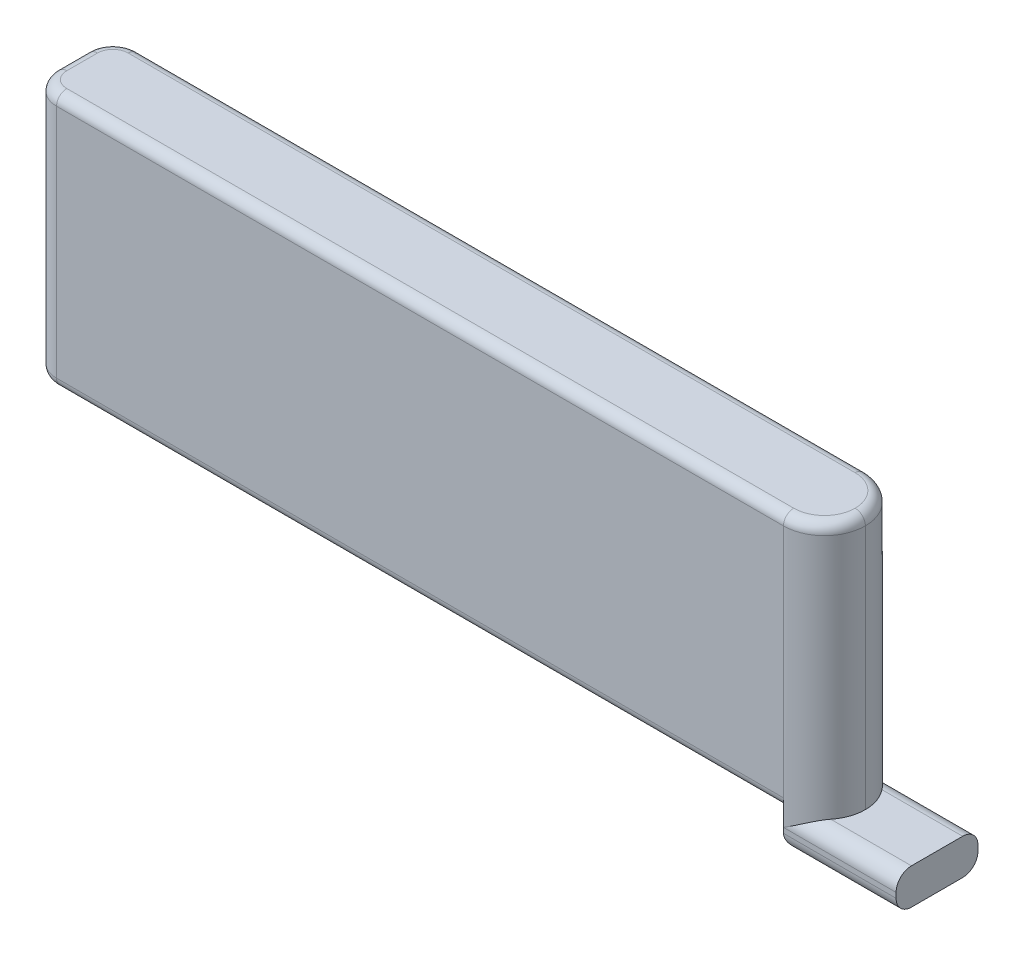
ISO-10303-21;
HEADER;
FILE_DESCRIPTION(('STEP AP214'),'2;1');
FILE_NAME('part.step','',(''),(''),'','','');
FILE_SCHEMA(('AUTOMOTIVE_DESIGN { 1 0 10303 214 1 1 1 1 }'));
ENDSEC;
DATA;
#1=APPLICATION_CONTEXT('core data for automotive mechanical design processes');
#2=APPLICATION_PROTOCOL_DEFINITION('international standard','automotive_design',2000,#1);
#3=PRODUCT_CONTEXT('',#1,'mechanical');
#4=PRODUCT('Part','Part','',(#3));
#5=PRODUCT_RELATED_PRODUCT_CATEGORY('part','',(#4));
#6=PRODUCT_DEFINITION_FORMATION('','',#4);
#7=PRODUCT_DEFINITION_CONTEXT('part definition',#1,'design');
#8=PRODUCT_DEFINITION('design','',#6,#7);
#9=PRODUCT_DEFINITION_SHAPE('','',#8);
#10=(LENGTH_UNIT() NAMED_UNIT(*) SI_UNIT(.MILLI.,.METRE.));
#11=(NAMED_UNIT(*) PLANE_ANGLE_UNIT() SI_UNIT($,.RADIAN.));
#12=(NAMED_UNIT(*) SI_UNIT($,.STERADIAN.) SOLID_ANGLE_UNIT());
#13=UNCERTAINTY_MEASURE_WITH_UNIT(LENGTH_MEASURE(1.E-05),#10,'distance_accuracy_value','');
#14=(GEOMETRIC_REPRESENTATION_CONTEXT(3) GLOBAL_UNCERTAINTY_ASSIGNED_CONTEXT((#13)) GLOBAL_UNIT_ASSIGNED_CONTEXT((#10,
#11,#12)) REPRESENTATION_CONTEXT('',''));
#15=CARTESIAN_POINT('',(0.,0.,0.));
#16=DIRECTION('',(0.,0.,1.));
#17=DIRECTION('',(1.,0.,0.));
#18=AXIS2_PLACEMENT_3D('',#15,#16,#17);
#19=CARTESIAN_POINT('',(0.,0.,16.));
#20=DIRECTION('',(0.,0.,1.));
#21=DIRECTION('',(1.,0.,0.));
#22=AXIS2_PLACEMENT_3D('',#19,#20,#21);
#23=PLANE('',#22);
#24=DIRECTION('',(0.,1.,0.));
#25=VECTOR('',#24,1.);
#26=CARTESIAN_POINT('',(92.1561214272367,21.854032832294,16.));
#27=LINE('',#26,#25);
#28=CARTESIAN_POINT('',(92.1561214272366,-26.145967167706,16.));
#29=VERTEX_POINT('',#28);
#30=CARTESIAN_POINT('',(92.1561214272367,19.854032832294,16.));
#31=VERTEX_POINT('',#30);
#32=EDGE_CURVE('E277',#29,#31,#27,.T.);
#33=ORIENTED_EDGE('',*,*,#32,.T.);
#34=DIRECTION('',(-1.,0.,0.));
#35=VECTOR('',#34,1.);
#36=CARTESIAN_POINT('',(-49.8438785727633,19.854032832294,16.));
#37=LINE('',#36,#35);
#38=CARTESIAN_POINT('',(-49.8438785727633,19.854032832294,16.));
#39=VERTEX_POINT('',#38);
#40=EDGE_CURVE('E445',#31,#39,#37,.T.);
#41=ORIENTED_EDGE('',*,*,#40,.T.);
#42=DIRECTION('',(0.,-1.,0.));
#43=VECTOR('',#42,1.);
#44=CARTESIAN_POINT('',(-49.8438785727633,-28.145967167706,16.));
#45=LINE('',#44,#43);
#46=CARTESIAN_POINT('',(-49.8438785727633,-26.145967167706,16.));
#47=VERTEX_POINT('',#46);
#48=EDGE_CURVE('E249',#39,#47,#45,.T.);
#49=ORIENTED_EDGE('',*,*,#48,.T.);
#50=DIRECTION('',(1.,0.,0.));
#51=VECTOR('',#50,1.);
#52=CARTESIAN_POINT('',(92.1561214272367,-26.145967167706,16.));
#53=LINE('',#52,#51);
#54=EDGE_CURVE('E425',#47,#29,#53,.T.);
#55=ORIENTED_EDGE('',*,*,#54,.T.);
#56=EDGE_LOOP('',(#33,#41,#49,#55));
#57=FACE_BOUND('',#56,.T.);
#58=ADVANCED_FACE('F35',(#57),#23,.T.);
#59=CARTESIAN_POINT('',(0.,0.,0.));
#60=DIRECTION('',(0.,0.,1.));
#61=DIRECTION('',(1.,0.,0.));
#62=AXIS2_PLACEMENT_3D('',#59,#60,#61);
#63=PLANE('',#62);
#64=DIRECTION('',(0.,-1.,0.));
#65=VECTOR('',#64,1.);
#66=CARTESIAN_POINT('',(-49.8438785727633,0.,0.));
#67=LINE('',#66,#65);
#68=CARTESIAN_POINT('',(-49.8438785727633,-26.145967167706,0.));
#69=VERTEX_POINT('',#68);
#70=CARTESIAN_POINT('',(-49.8438785727633,19.854032832294,0.));
#71=VERTEX_POINT('',#70);
#72=EDGE_CURVE('E246',#69,#71,#67,.F.);
#73=ORIENTED_EDGE('',*,*,#72,.T.);
#74=DIRECTION('',(-1.,0.,0.));
#75=VECTOR('',#74,1.);
#76=CARTESIAN_POINT('',(0.,19.854032832294,0.));
#77=LINE('',#76,#75);
#78=CARTESIAN_POINT('',(92.1561214272367,19.854032832294,0.));
#79=VERTEX_POINT('',#78);
#80=EDGE_CURVE('E437',#71,#79,#77,.F.);
#81=ORIENTED_EDGE('',*,*,#80,.T.);
#82=DIRECTION('',(0.,1.,0.));
#83=VECTOR('',#82,1.);
#84=CARTESIAN_POINT('',(92.1561214272367,0.,0.));
#85=LINE('',#84,#83);
#86=CARTESIAN_POINT('',(92.1561214272366,-26.145967167706,0.));
#87=VERTEX_POINT('',#86);
#88=EDGE_CURVE('E252',#79,#87,#85,.F.);
#89=ORIENTED_EDGE('',*,*,#88,.T.);
#90=DIRECTION('',(1.,0.,0.));
#91=VECTOR('',#90,1.);
#92=CARTESIAN_POINT('',(0.,-26.145967167706,0.));
#93=LINE('',#92,#91);
#94=EDGE_CURVE('E435',#87,#69,#93,.F.);
#95=ORIENTED_EDGE('',*,*,#94,.T.);
#96=EDGE_LOOP('',(#73,#81,#89,#95));
#97=FACE_BOUND('',#96,.T.);
#98=ADVANCED_FACE('F388',(#97),#63,.F.);
#99=CARTESIAN_POINT('',(-54.8438785727633,21.854032832294,16.));
#100=DIRECTION('',(1.,0.,0.));
#101=DIRECTION('',(0.,1.,0.));
#102=AXIS2_PLACEMENT_3D('',#99,#100,#101);
#103=PLANE('',#102);
#104=DIRECTION('',(0.,-1.,0.));
#105=VECTOR('',#104,1.);
#106=CARTESIAN_POINT('',(-54.8438785727633,21.854032832294,11.));
#107=LINE('',#106,#105);
#108=CARTESIAN_POINT('',(-54.8438785727633,-26.145967167706,11.));
#109=VERTEX_POINT('',#108);
#110=CARTESIAN_POINT('',(-54.8438785727633,19.854032832294,11.));
#111=VERTEX_POINT('',#110);
#112=EDGE_CURVE('E232',#109,#111,#107,.F.);
#113=ORIENTED_EDGE('',*,*,#112,.T.);
#114=DIRECTION('',(0.,0.,-1.));
#115=VECTOR('',#114,1.);
#116=CARTESIAN_POINT('',(-54.8438785727633,19.854032832294,16.));
#117=LINE('',#116,#115);
#118=CARTESIAN_POINT('',(-54.8438785727633,19.854032832294,5.));
#119=VERTEX_POINT('',#118);
#120=EDGE_CURVE('E295',#111,#119,#117,.T.);
#121=ORIENTED_EDGE('',*,*,#120,.T.);
#122=DIRECTION('',(0.,-1.,0.));
#123=VECTOR('',#122,1.);
#124=CARTESIAN_POINT('',(-54.8438785727633,21.854032832294,5.));
#125=LINE('',#124,#123);
#126=CARTESIAN_POINT('',(-54.8438785727633,-26.145967167706,5.));
#127=VERTEX_POINT('',#126);
#128=EDGE_CURVE('E243',#119,#127,#125,.T.);
#129=ORIENTED_EDGE('',*,*,#128,.T.);
#130=DIRECTION('',(0.,0.,-1.));
#131=VECTOR('',#130,1.);
#132=CARTESIAN_POINT('',(-54.8438785727633,-26.145967167706,16.));
#133=LINE('',#132,#131);
#134=EDGE_CURVE('E293',#127,#109,#133,.F.);
#135=ORIENTED_EDGE('',*,*,#134,.T.);
#136=EDGE_LOOP('',(#113,#121,#129,#135));
#137=FACE_BOUND('',#136,.T.);
#138=ADVANCED_FACE('F395',(#137),#103,.F.);
#139=CARTESIAN_POINT('',(-54.8438785727633,-28.145967167706,16.));
#140=DIRECTION('',(0.,1.,0.));
#141=DIRECTION('',(0.,0.,1.));
#142=AXIS2_PLACEMENT_3D('',#139,#140,#141);
#143=PLANE('',#142);
#144=CARTESIAN_POINT('',(-49.8438785727633,-28.145967167706,5.));
#145=DIRECTION('',(0.,1.,0.));
#146=DIRECTION('',(0.,0.,1.));
#147=AXIS2_PLACEMENT_3D('',#144,#145,#146);
#148=CIRCLE('',#147,3.);
#149=CARTESIAN_POINT('',(-52.8438785727633,-28.145967167706,5.));
#150=VERTEX_POINT('',#149);
#151=CARTESIAN_POINT('',(-49.8438785727633,-28.145967167706,2.));
#152=VERTEX_POINT('',#151);
#153=EDGE_CURVE('E432',#150,#152,#148,.F.);
#154=ORIENTED_EDGE('',*,*,#153,.T.);
#155=DIRECTION('',(1.,0.,0.));
#156=VECTOR('',#155,1.);
#157=CARTESIAN_POINT('',(-54.8438785727633,-28.145967167706,2.));
#158=LINE('',#157,#156);
#159=CARTESIAN_POINT('',(92.1561214272366,-28.145967167706,2.));
#160=VERTEX_POINT('',#159);
#161=EDGE_CURVE('E430',#152,#160,#158,.T.);
#162=ORIENTED_EDGE('',*,*,#161,.T.);
#163=DIRECTION('',(0.,0.,1.));
#164=VECTOR('',#163,1.);
#165=CARTESIAN_POINT('',(92.1561214272366,-28.145967167706,0.));
#166=LINE('',#165,#164);
#167=CARTESIAN_POINT('',(92.1561214272366,-28.145967167706,14.));
#168=VERTEX_POINT('',#167);
#169=EDGE_CURVE('E199',#160,#168,#166,.T.);
#170=ORIENTED_EDGE('',*,*,#169,.T.);
#171=DIRECTION('',(1.,0.,0.));
#172=VECTOR('',#171,1.);
#173=CARTESIAN_POINT('',(-49.8438785727633,-28.145967167706,14.));
#174=LINE('',#173,#172);
#175=CARTESIAN_POINT('',(-49.8438785727633,-28.145967167706,14.));
#176=VERTEX_POINT('',#175);
#177=EDGE_CURVE('E301',#168,#176,#174,.F.);
#178=ORIENTED_EDGE('',*,*,#177,.T.);
#179=CARTESIAN_POINT('',(-49.8438785727633,-28.145967167706,11.));
#180=DIRECTION('',(0.,1.,0.));
#181=DIRECTION('',(0.,0.,1.));
#182=AXIS2_PLACEMENT_3D('',#179,#180,#181);
#183=CIRCLE('',#182,3.);
#184=CARTESIAN_POINT('',(-52.8438785727633,-28.145967167706,11.));
#185=VERTEX_POINT('',#184);
#186=EDGE_CURVE('E481',#176,#185,#183,.F.);
#187=ORIENTED_EDGE('',*,*,#186,.T.);
#188=DIRECTION('',(0.,0.,-1.));
#189=VECTOR('',#188,1.);
#190=CARTESIAN_POINT('',(-52.8438785727633,-28.145967167706,16.));
#191=LINE('',#190,#189);
#192=EDGE_CURVE('E439',#185,#150,#191,.T.);
#193=ORIENTED_EDGE('',*,*,#192,.T.);
#194=EDGE_LOOP('',(#154,#162,#170,#178,#187,#193));
#195=FACE_BOUND('',#194,.T.);
#196=ADVANCED_FACE('F406',(#195),#143,.F.);
#197=CARTESIAN_POINT('',(-54.8438785727633,21.854032832294,16.));
#198=DIRECTION('',(0.,-1.,0.));
#199=DIRECTION('',(0.,0.,-1.));
#200=AXIS2_PLACEMENT_3D('',#197,#198,#199);
#201=PLANE('',#200);
#202=CARTESIAN_POINT('',(92.1561214272367,21.854032832294,8.));
#203=DIRECTION('',(0.,-1.,0.));
#204=DIRECTION('',(0.,0.,-1.));
#205=AXIS2_PLACEMENT_3D('',#202,#203,#204);
#206=CIRCLE('',#205,6.);
#207=CARTESIAN_POINT('',(92.1561214272367,21.854032832294,14.));
#208=VERTEX_POINT('',#207);
#209=CARTESIAN_POINT('',(98.1561214272367,21.854032832294,8.));
#210=VERTEX_POINT('',#209);
#211=EDGE_CURVE('E513',#208,#210,#206,.F.);
#212=ORIENTED_EDGE('',*,*,#211,.T.);
#213=CARTESIAN_POINT('',(92.1561214272367,21.854032832294,8.));
#214=DIRECTION('',(0.,-1.,0.));
#215=DIRECTION('',(0.,0.,-1.));
#216=AXIS2_PLACEMENT_3D('',#213,#214,#215);
#217=CIRCLE('',#216,6.);
#218=CARTESIAN_POINT('',(92.1561214272367,21.854032832294,2.));
#219=VERTEX_POINT('',#218);
#220=EDGE_CURVE('E281',#210,#219,#217,.F.);
#221=ORIENTED_EDGE('',*,*,#220,.T.);
#222=DIRECTION('',(-1.,0.,0.));
#223=VECTOR('',#222,1.);
#224=CARTESIAN_POINT('',(-54.8438785727633,21.854032832294,2.));
#225=LINE('',#224,#223);
#226=CARTESIAN_POINT('',(-49.8438785727633,21.854032832294,2.));
#227=VERTEX_POINT('',#226);
#228=EDGE_CURVE('E512',#219,#227,#225,.T.);
#229=ORIENTED_EDGE('',*,*,#228,.T.);
#230=CARTESIAN_POINT('',(-49.8438785727633,21.854032832294,5.));
#231=DIRECTION('',(0.,-1.,0.));
#232=DIRECTION('',(0.,0.,-1.));
#233=AXIS2_PLACEMENT_3D('',#230,#231,#232);
#234=CIRCLE('',#233,3.);
#235=CARTESIAN_POINT('',(-52.8438785727633,21.854032832294,5.));
#236=VERTEX_POINT('',#235);
#237=EDGE_CURVE('E496',#227,#236,#234,.F.);
#238=ORIENTED_EDGE('',*,*,#237,.T.);
#239=DIRECTION('',(0.,0.,-1.));
#240=VECTOR('',#239,1.);
#241=CARTESIAN_POINT('',(-52.8438785727633,21.854032832294,16.));
#242=LINE('',#241,#240);
#243=CARTESIAN_POINT('',(-52.8438785727633,21.854032832294,11.));
#244=VERTEX_POINT('',#243);
#245=EDGE_CURVE('E516',#236,#244,#242,.F.);
#246=ORIENTED_EDGE('',*,*,#245,.T.);
#247=CARTESIAN_POINT('',(-49.8438785727633,21.854032832294,11.));
#248=DIRECTION('',(0.,-1.,0.));
#249=DIRECTION('',(0.,0.,-1.));
#250=AXIS2_PLACEMENT_3D('',#247,#248,#249);
#251=CIRCLE('',#250,3.);
#252=CARTESIAN_POINT('',(-49.8438785727633,21.854032832294,14.));
#253=VERTEX_POINT('',#252);
#254=EDGE_CURVE('E520',#244,#253,#251,.F.);
#255=ORIENTED_EDGE('',*,*,#254,.T.);
#256=DIRECTION('',(-1.,0.,0.));
#257=VECTOR('',#256,1.);
#258=CARTESIAN_POINT('',(92.1561214272367,21.854032832294,14.));
#259=LINE('',#258,#257);
#260=EDGE_CURVE('E351',#253,#208,#259,.F.);
#261=ORIENTED_EDGE('',*,*,#260,.T.);
#262=EDGE_LOOP('',(#212,#221,#229,#238,#246,#255,#261));
#263=FACE_BOUND('',#262,.T.);
#264=ADVANCED_FACE('F400',(#263),#201,.F.);
#265=DIRECTION('',(-1.,0.,0.));
#266=VECTOR('',#265,1.);
#267=CARTESIAN_POINT('',(0.,-31.145967167706,16.));
#268=LINE('',#267,#266);
#269=CARTESIAN_POINT('',(114.156121427237,-31.145967167706,16.));
#270=VERTEX_POINT('',#269);
#271=CARTESIAN_POINT('',(92.1561214272366,-31.145967167706,16.));
#272=VERTEX_POINT('',#271);
#273=EDGE_CURVE('E220',#270,#272,#268,.T.);
#274=ORIENTED_EDGE('',*,*,#273,.T.);
#275=DIRECTION('',(0.,-1.,0.));
#276=VECTOR('',#275,1.);
#277=CARTESIAN_POINT('',(92.1561214272366,-28.145967167706,16.));
#278=LINE('',#277,#276);
#279=CARTESIAN_POINT('',(92.1561214272366,-32.145967167706,16.));
#280=VERTEX_POINT('',#279);
#281=EDGE_CURVE('E240',#272,#280,#278,.T.);
#282=ORIENTED_EDGE('',*,*,#281,.T.);
#283=DIRECTION('',(1.,0.,0.));
#284=VECTOR('',#283,1.);
#285=CARTESIAN_POINT('',(0.,-32.145967167706,16.));
#286=LINE('',#285,#284);
#287=CARTESIAN_POINT('',(114.156121427237,-32.145967167706,16.));
#288=VERTEX_POINT('',#287);
#289=EDGE_CURVE('E189',#280,#288,#286,.T.);
#290=ORIENTED_EDGE('',*,*,#289,.T.);
#291=DIRECTION('',(0.,1.,0.));
#292=VECTOR('',#291,1.);
#293=CARTESIAN_POINT('',(114.156121427237,-28.145967167706,16.));
#294=LINE('',#293,#292);
#295=EDGE_CURVE('E255',#288,#270,#294,.T.);
#296=ORIENTED_EDGE('',*,*,#295,.T.);
#297=EDGE_LOOP('',(#274,#282,#290,#296));
#298=FACE_BOUND('',#297,.T.);
#299=ADVANCED_FACE('F391',(#298),#23,.T.);
#300=DIRECTION('',(0.,-1.,0.));
#301=VECTOR('',#300,1.);
#302=CARTESIAN_POINT('',(92.1561214272366,-28.145967167706,0.));
#303=LINE('',#302,#301);
#304=CARTESIAN_POINT('',(92.1561214272366,-31.145967167706,0.));
#305=VERTEX_POINT('',#304);
#306=CARTESIAN_POINT('',(92.1561214272366,-32.145967167706,0.));
#307=VERTEX_POINT('',#306);
#308=EDGE_CURVE('E253',#305,#307,#303,.T.);
#309=ORIENTED_EDGE('',*,*,#308,.F.);
#310=DIRECTION('',(-1.,0.,0.));
#311=VECTOR('',#310,1.);
#312=CARTESIAN_POINT('',(114.156121427237,-31.145967167706,0.));
#313=LINE('',#312,#311);
#314=CARTESIAN_POINT('',(114.156121427237,-31.145967167706,0.));
#315=VERTEX_POINT('',#314);
#316=EDGE_CURVE('E208',#305,#315,#313,.F.);
#317=ORIENTED_EDGE('',*,*,#316,.T.);
#318=DIRECTION('',(0.,1.,0.));
#319=VECTOR('',#318,1.);
#320=CARTESIAN_POINT('',(114.156121427237,-28.145967167706,0.));
#321=LINE('',#320,#319);
#322=CARTESIAN_POINT('',(114.156121427237,-32.145967167706,0.));
#323=VERTEX_POINT('',#322);
#324=EDGE_CURVE('E186',#323,#315,#321,.T.);
#325=ORIENTED_EDGE('',*,*,#324,.F.);
#326=DIRECTION('',(1.,0.,0.));
#327=VECTOR('',#326,1.);
#328=CARTESIAN_POINT('',(92.1561214272366,-32.145967167706,0.));
#329=LINE('',#328,#327);
#330=EDGE_CURVE('E205',#323,#307,#329,.F.);
#331=ORIENTED_EDGE('',*,*,#330,.T.);
#332=EDGE_LOOP('',(#309,#317,#325,#331));
#333=FACE_BOUND('',#332,.T.);
#334=ADVANCED_FACE('F330',(#333),#63,.F.);
#335=CARTESIAN_POINT('',(92.1561214272366,-28.145967167706,0.));
#336=DIRECTION('',(0.,1.,0.));
#337=DIRECTION('',(0.,0.,1.));
#338=AXIS2_PLACEMENT_3D('',#335,#336,#337);
#339=PLANE('',#338);
#340=DIRECTION('',(0.,0.,1.));
#341=VECTOR('',#340,1.);
#342=CARTESIAN_POINT('',(114.156121427237,-28.145967167706,0.));
#343=LINE('',#342,#341);
#344=CARTESIAN_POINT('',(114.156121427237,-28.145967167706,3.));
#345=VERTEX_POINT('',#344);
#346=CARTESIAN_POINT('',(114.156121427237,-28.145967167706,13.));
#347=VERTEX_POINT('',#346);
#348=EDGE_CURVE('E183',#345,#347,#343,.T.);
#349=ORIENTED_EDGE('',*,*,#348,.F.);
#350=DIRECTION('',(-1.,0.,0.));
#351=VECTOR('',#350,1.);
#352=CARTESIAN_POINT('',(100.156121427237,-28.145967167706,3.));
#353=LINE('',#352,#351);
#354=CARTESIAN_POINT('',(98.401119425635,-28.145967167706,3.));
#355=VERTEX_POINT('',#354);
#356=EDGE_CURVE('E195',#345,#355,#353,.T.);
#357=ORIENTED_EDGE('',*,*,#356,.T.);
#358=CARTESIAN_POINT('',(92.1561214272366,-28.145967167706,8.));
#359=DIRECTION('',(0.,1.,0.));
#360=DIRECTION('',(0.,0.,1.));
#361=AXIS2_PLACEMENT_3D('',#358,#359,#360);
#362=CIRCLE('',#361,8.);
#363=CARTESIAN_POINT('',(100.156121427237,-28.145967167706,8.));
#364=VERTEX_POINT('',#363);
#365=EDGE_CURVE('E338',#355,#364,#362,.F.);
#366=ORIENTED_EDGE('',*,*,#365,.T.);
#367=CARTESIAN_POINT('',(92.1561214272366,-28.145967167706,8.));
#368=DIRECTION('',(0.,1.,0.));
#369=DIRECTION('',(0.,0.,1.));
#370=AXIS2_PLACEMENT_3D('',#367,#368,#369);
#371=CIRCLE('',#370,8.);
#372=CARTESIAN_POINT('',(98.401119425635,-28.145967167706,13.));
#373=VERTEX_POINT('',#372);
#374=EDGE_CURVE('E339',#364,#373,#371,.F.);
#375=ORIENTED_EDGE('',*,*,#374,.T.);
#376=DIRECTION('',(-1.,0.,0.));
#377=VECTOR('',#376,1.);
#378=CARTESIAN_POINT('',(92.1561214272366,-28.145967167706,13.));
#379=LINE('',#378,#377);
#380=EDGE_CURVE('E198',#373,#347,#379,.F.);
#381=ORIENTED_EDGE('',*,*,#380,.T.);
#382=EDGE_LOOP('',(#349,#357,#366,#375,#381));
#383=FACE_BOUND('',#382,.T.);
#384=ADVANCED_FACE('F193',(#383),#339,.T.);
#385=CARTESIAN_POINT('',(92.1561214272366,-28.145967167706,0.));
#386=DIRECTION('',(-1.,0.,0.));
#387=DIRECTION('',(0.,0.,1.));
#388=AXIS2_PLACEMENT_3D('',#385,#386,#387);
#389=PLANE('',#388);
#390=EDGE_CURVE('E53',#87,#305,#303,.T.);
#391=ORIENTED_EDGE('',*,*,#390,.T.);
#392=ORIENTED_EDGE('',*,*,#308,.T.);
#393=DIRECTION('',(0.,0.,1.));
#394=VECTOR('',#393,1.);
#395=CARTESIAN_POINT('',(92.1561214272366,-32.145967167706,0.));
#396=LINE('',#395,#394);
#397=EDGE_CURVE('E229',#307,#280,#396,.T.);
#398=ORIENTED_EDGE('',*,*,#397,.T.);
#399=ORIENTED_EDGE('',*,*,#281,.F.);
#400=EDGE_CURVE('E264',#29,#272,#278,.T.);
#401=ORIENTED_EDGE('',*,*,#400,.F.);
#402=CARTESIAN_POINT('',(92.1561214272366,-26.145967167706,14.));
#403=DIRECTION('',(-1.,0.,0.));
#404=DIRECTION('',(0.,0.,1.));
#405=AXIS2_PLACEMENT_3D('',#402,#403,#404);
#406=CIRCLE('',#405,2.);
#407=EDGE_CURVE('E11',#29,#168,#406,.F.);
#408=ORIENTED_EDGE('',*,*,#407,.T.);
#409=ORIENTED_EDGE('',*,*,#169,.F.);
#410=CARTESIAN_POINT('',(92.1561214272367,-26.145967167706,2.));
#411=DIRECTION('',(-1.,0.,0.));
#412=DIRECTION('',(0.,0.,1.));
#413=AXIS2_PLACEMENT_3D('',#410,#411,#412);
#414=CIRCLE('',#413,2.);
#415=EDGE_CURVE('E45',#160,#87,#414,.F.);
#416=ORIENTED_EDGE('',*,*,#415,.T.);
#417=EDGE_LOOP('',(#391,#392,#398,#399,#401,#408,#409,#416));
#418=FACE_BOUND('',#417,.T.);
#419=ADVANCED_FACE('F333',(#418),#389,.T.);
#420=CARTESIAN_POINT('',(114.156121427237,-28.145967167706,0.));
#421=DIRECTION('',(1.,0.,0.));
#422=DIRECTION('',(0.,0.,-1.));
#423=AXIS2_PLACEMENT_3D('',#420,#421,#422);
#424=PLANE('',#423);
#425=ORIENTED_EDGE('',*,*,#324,.T.);
#426=CARTESIAN_POINT('',(114.156121427237,-31.145967167706,3.));
#427=DIRECTION('',(1.,0.,0.));
#428=DIRECTION('',(0.,0.,-1.));
#429=AXIS2_PLACEMENT_3D('',#426,#427,#428);
#430=CIRCLE('',#429,3.);
#431=EDGE_CURVE('E180',#315,#345,#430,.T.);
#432=ORIENTED_EDGE('',*,*,#431,.T.);
#433=ORIENTED_EDGE('',*,*,#348,.T.);
#434=CARTESIAN_POINT('',(114.156121427237,-31.145967167706,13.));
#435=DIRECTION('',(1.,0.,0.));
#436=DIRECTION('',(0.,0.,-1.));
#437=AXIS2_PLACEMENT_3D('',#434,#435,#436);
#438=CIRCLE('',#437,3.);
#439=EDGE_CURVE('E190',#347,#270,#438,.T.);
#440=ORIENTED_EDGE('',*,*,#439,.T.);
#441=ORIENTED_EDGE('',*,*,#295,.F.);
#442=CARTESIAN_POINT('',(114.156121427237,-32.145967167706,13.));
#443=DIRECTION('',(1.,0.,0.));
#444=DIRECTION('',(0.,0.,-1.));
#445=AXIS2_PLACEMENT_3D('',#442,#443,#444);
#446=CIRCLE('',#445,3.);
#447=CARTESIAN_POINT('',(114.156121427237,-35.145967167706,13.));
#448=VERTEX_POINT('',#447);
#449=EDGE_CURVE('E214',#288,#448,#446,.T.);
#450=ORIENTED_EDGE('',*,*,#449,.T.);
#451=DIRECTION('',(0.,0.,1.));
#452=VECTOR('',#451,1.);
#453=CARTESIAN_POINT('',(114.156121427237,-35.145967167706,0.));
#454=LINE('',#453,#452);
#455=CARTESIAN_POINT('',(114.156121427237,-35.145967167706,3.));
#456=VERTEX_POINT('',#455);
#457=EDGE_CURVE('E200',#456,#448,#454,.T.);
#458=ORIENTED_EDGE('',*,*,#457,.F.);
#459=CARTESIAN_POINT('',(114.156121427237,-32.145967167706,3.));
#460=DIRECTION('',(1.,0.,0.));
#461=DIRECTION('',(0.,0.,-1.));
#462=AXIS2_PLACEMENT_3D('',#459,#460,#461);
#463=CIRCLE('',#462,3.);
#464=EDGE_CURVE('E216',#456,#323,#463,.T.);
#465=ORIENTED_EDGE('',*,*,#464,.T.);
#466=EDGE_LOOP('',(#425,#432,#433,#440,#441,#450,#458,#465));
#467=FACE_BOUND('',#466,.T.);
#468=ADVANCED_FACE('F182',(#467),#424,.T.);
#469=CARTESIAN_POINT('',(92.1561214272366,-35.145967167706,0.));
#470=DIRECTION('',(0.,-1.,0.));
#471=DIRECTION('',(0.,0.,-1.));
#472=AXIS2_PLACEMENT_3D('',#469,#470,#471);
#473=PLANE('',#472);
#474=DIRECTION('',(0.,0.,1.));
#475=VECTOR('',#474,1.);
#476=CARTESIAN_POINT('',(95.1561214272366,-35.145967167706,0.));
#477=LINE('',#476,#475);
#478=CARTESIAN_POINT('',(95.1561214272366,-35.145967167706,13.));
#479=VERTEX_POINT('',#478);
#480=CARTESIAN_POINT('',(95.1561214272366,-35.145967167706,3.));
#481=VERTEX_POINT('',#480);
#482=EDGE_CURVE('E224',#479,#481,#477,.F.);
#483=ORIENTED_EDGE('',*,*,#482,.T.);
#484=DIRECTION('',(1.,0.,0.));
#485=VECTOR('',#484,1.);
#486=CARTESIAN_POINT('',(114.156121427237,-35.145967167706,3.));
#487=LINE('',#486,#485);
#488=EDGE_CURVE('E226',#481,#456,#487,.T.);
#489=ORIENTED_EDGE('',*,*,#488,.T.);
#490=ORIENTED_EDGE('',*,*,#457,.T.);
#491=DIRECTION('',(1.,0.,0.));
#492=VECTOR('',#491,1.);
#493=CARTESIAN_POINT('',(92.1561214272366,-35.145967167706,13.));
#494=LINE('',#493,#492);
#495=EDGE_CURVE('E222',#448,#479,#494,.F.);
#496=ORIENTED_EDGE('',*,*,#495,.T.);
#497=EDGE_LOOP('',(#483,#489,#490,#496));
#498=FACE_BOUND('',#497,.T.);
#499=ADVANCED_FACE('F313',(#498),#473,.T.);
#500=CARTESIAN_POINT('',(92.1561214272366,-31.145967167706,3.));
#501=DIRECTION('',(1.,0.,0.));
#502=DIRECTION('',(0.,0.,-1.));
#503=AXIS2_PLACEMENT_3D('',#500,#501,#502);
#504=CYLINDRICAL_SURFACE('',#503,3.);
#505=ORIENTED_EDGE('',*,*,#431,.F.);
#506=ORIENTED_EDGE('',*,*,#316,.F.);
#507=CARTESIAN_POINT('',(98.401119425635,-28.145967167706,3.));
#508=CARTESIAN_POINT('',(98.3211815918908,-28.1459786270375,2.90012740893926));
#509=CARTESIAN_POINT('',(98.238874475212,-28.1509519312092,2.80226404930017));
#510=CARTESIAN_POINT('',(98.0702475670475,-28.1697206074093,2.61119307546955));
#511=CARTESIAN_POINT('',(97.9839341892531,-28.1835023009408,2.51797848376018));
#512=CARTESIAN_POINT('',(97.8085311060574,-28.2186403060372,2.33731454737105));
#513=CARTESIAN_POINT('',(97.7194718694874,-28.239930074366,2.2498223123131));
#514=CARTESIAN_POINT('',(97.53832667637,-28.2891703982844,2.07992445088031));
#515=CARTESIAN_POINT('',(97.4462390854081,-28.3171246032951,1.99752164269431));
#516=CARTESIAN_POINT('',(97.2126226634606,-28.394329000735,1.79791897259754));
#517=CARTESIAN_POINT('',(97.0694746550641,-28.4472261697169,1.68401001072875));
#518=CARTESIAN_POINT('',(96.7786060569789,-28.5636449025815,1.4681187113979));
#519=CARTESIAN_POINT('',(96.6308840540652,-28.6271697773412,1.36614010750735));
#520=CARTESIAN_POINT('',(96.3309676754272,-28.7632194923203,1.17338934688602));
#521=CARTESIAN_POINT('',(96.1787525246276,-28.8357938122339,1.08268474476541));
#522=CARTESIAN_POINT('',(95.8714414190076,-28.9879725395841,0.912883351656064));
#523=CARTESIAN_POINT('',(95.7163454637757,-29.0675769480248,0.83378656232517));
#524=CARTESIAN_POINT('',(95.3385807692455,-29.2668807465817,0.656167851185834));
#525=CARTESIAN_POINT('',(95.1147388932755,-29.3894424116561,0.563326242788687));
#526=CARTESIAN_POINT('',(94.66372139757,-29.6428012380079,0.399371240813386));
#527=CARTESIAN_POINT('',(94.4365441525207,-29.7736025239748,0.328268835644917));
#528=CARTESIAN_POINT('',(93.9804614812237,-30.0405944518893,0.207225909116083));
#529=CARTESIAN_POINT('',(93.7515608047713,-30.1767729371357,0.157240341192535));
#530=CARTESIAN_POINT('',(93.2924873200059,-30.4526217267773,0.0776957518770688));
#531=CARTESIAN_POINT('',(93.0623152960306,-30.5922900326652,0.0481253051542956));
#532=CARTESIAN_POINT('',(92.7218470632181,-30.7998478212585,0.0192643903144417));
#533=CARTESIAN_POINT('',(92.6117651280853,-30.8671046647867,0.0122256069387114));
#534=CARTESIAN_POINT('',(92.3915780748417,-31.0017835493179,0.00270697645832691));
#535=CARTESIAN_POINT('',(92.2814730074137,-31.0692054715508,0.000224481356878403));
#536=CARTESIAN_POINT('',(92.1662916762634,-31.139739187718,4.84889152998914E-06));
#537=CARTESIAN_POINT('',(92.1612065396815,-31.1428531852046,4.94771138972778E-10));
#538=CARTESIAN_POINT('',(92.1561214272366,-31.145967167706,0.));
#539=B_SPLINE_CURVE_WITH_KNOTS('',3,(#507,#508,#509,#510,#511,#512,#513,#514,#515,#516,#517,
#518,#519,#520,#521,#522,#523,#524,#525,#526,#527,#528,#529,#530,#531,#532,#533,#534,#535,#536,
#537,#538),.UNSPECIFIED.,.F.,.F.,(4,2,2,2,2,2,2,2,2,2,2,2,2,2,2,4),(0.,0.383512110045629,
0.766430108588835,1.14603627767904,1.52585079711805,2.09627818364467,2.66688360895348,
3.24075829970253,3.81463307241233,4.6281404589082,5.44205836781335,6.25423114605853,
7.06594902221543,7.4534704109641,7.84076651091109,7.85865506064467),.UNSPECIFIED.);
#540=EDGE_CURVE('E203',#305,#355,#539,.F.);
#541=ORIENTED_EDGE('',*,*,#540,.T.);
#542=ORIENTED_EDGE('',*,*,#356,.F.);
#543=EDGE_LOOP('',(#505,#506,#541,#542));
#544=FACE_BOUND('',#543,.T.);
#545=ADVANCED_FACE('F202',(#544),#504,.T.);
#546=CARTESIAN_POINT('',(0.,-31.145967167706,13.));
#547=DIRECTION('',(-1.,0.,0.));
#548=DIRECTION('',(0.,0.,1.));
#549=AXIS2_PLACEMENT_3D('',#546,#547,#548);
#550=CYLINDRICAL_SURFACE('',#549,3.);
#551=ORIENTED_EDGE('',*,*,#439,.F.);
#552=ORIENTED_EDGE('',*,*,#380,.F.);
#553=CARTESIAN_POINT('',(98.401119425635,-28.145967167706,13.));
#554=CARTESIAN_POINT('',(98.3211815918909,-28.1459786270375,13.0998725910607));
#555=CARTESIAN_POINT('',(98.2388744752121,-28.1509519312091,13.1977359506998));
#556=CARTESIAN_POINT('',(98.0702475670476,-28.1697206074093,13.3888069245304));
#557=CARTESIAN_POINT('',(97.9839341892532,-28.1835023009408,13.4820215162397));
#558=CARTESIAN_POINT('',(97.8085311060575,-28.2186403060371,13.6626854526289));
#559=CARTESIAN_POINT('',(97.7194718694875,-28.239930074366,13.7501776876868));
#560=CARTESIAN_POINT('',(97.53832667637,-28.2891703982844,13.9200755491197));
#561=CARTESIAN_POINT('',(97.4462390854081,-28.3171246032951,14.0024783573057));
#562=CARTESIAN_POINT('',(97.2126226634606,-28.394329000735,14.2020810274025));
#563=CARTESIAN_POINT('',(97.069474655064,-28.4472261697169,14.3159899892713));
#564=CARTESIAN_POINT('',(96.7786060569788,-28.5636449025815,14.5318812886021));
#565=CARTESIAN_POINT('',(96.6308840540651,-28.6271697773413,14.6338598924927));
#566=CARTESIAN_POINT('',(96.3309676754271,-28.7632194923203,14.826610653114));
#567=CARTESIAN_POINT('',(96.1787525246275,-28.8357938122339,14.9173152552346));
#568=CARTESIAN_POINT('',(95.8714414190075,-28.9879725395842,15.0871166483439));
#569=CARTESIAN_POINT('',(95.7163454637757,-29.0675769480248,15.1662134376748));
#570=CARTESIAN_POINT('',(95.3385807692455,-29.2668807465816,15.3438321488141));
#571=CARTESIAN_POINT('',(95.1147388932755,-29.3894424116561,15.4366737572113));
#572=CARTESIAN_POINT('',(94.66372139757,-29.6428012380078,15.6006287591866));
#573=CARTESIAN_POINT('',(94.4365441525208,-29.7736025239747,15.6717311643551));
#574=CARTESIAN_POINT('',(93.9804614812238,-30.0405944518892,15.7927740908839));
#575=CARTESIAN_POINT('',(93.7515608047715,-30.1767729371358,15.8427596588075));
#576=CARTESIAN_POINT('',(93.2924873200058,-30.4526217267771,15.9223042481229));
#577=CARTESIAN_POINT('',(93.0623152960302,-30.5922900326645,15.9518746948457));
#578=CARTESIAN_POINT('',(92.7218470632183,-30.7998478212588,15.9807356096856));
#579=CARTESIAN_POINT('',(92.6117651280859,-30.8671046647876,15.9877743930613));
#580=CARTESIAN_POINT('',(92.3915780748411,-31.001783549317,15.9972930235417));
#581=CARTESIAN_POINT('',(92.2814730074115,-31.0692054715472,15.9997755186431));
#582=CARTESIAN_POINT('',(92.1662916762632,-31.1397391877176,15.9999951511085));
#583=CARTESIAN_POINT('',(92.1612065396814,-31.1428531852044,15.9999999995052));
#584=CARTESIAN_POINT('',(92.1561214272366,-31.145967167706,16.));
#585=B_SPLINE_CURVE_WITH_KNOTS('',3,(#553,#554,#555,#556,#557,#558,#559,#560,#561,#562,#563,
#564,#565,#566,#567,#568,#569,#570,#571,#572,#573,#574,#575,#576,#577,#578,#579,#580,#581,#582,
#583,#584),.UNSPECIFIED.,.F.,.F.,(4,2,2,2,2,2,2,2,2,2,2,2,2,2,2,4),(0.,0.383512110045549,
0.76643010858869,1.14603627767897,1.52585079711805,2.09627818364474,2.66688360895361,
3.24075829970258,3.81463307241231,4.62814045890811,5.44205836781321,6.25423114605848,
7.06594902221541,7.45347041096409,7.84076651091108,7.85865506064467),.UNSPECIFIED.);
#586=EDGE_CURVE('E341',#373,#272,#585,.T.);
#587=ORIENTED_EDGE('',*,*,#586,.T.);
#588=ORIENTED_EDGE('',*,*,#273,.F.);
#589=EDGE_LOOP('',(#551,#552,#587,#588));
#590=FACE_BOUND('',#589,.T.);
#591=ADVANCED_FACE('F356',(#590),#550,.T.);
#592=CARTESIAN_POINT('',(0.,-32.145967167706,13.));
#593=DIRECTION('',(1.,0.,0.));
#594=DIRECTION('',(0.,0.,-1.));
#595=AXIS2_PLACEMENT_3D('',#592,#593,#594);
#596=CYLINDRICAL_SURFACE('',#595,3.);
#597=ORIENTED_EDGE('',*,*,#449,.F.);
#598=ORIENTED_EDGE('',*,*,#289,.F.);
#599=CARTESIAN_POINT('',(95.1561214272366,-32.145967167706,13.));
#600=DIRECTION('',(0.707106781186547,0.,0.707106781186547));
#601=DIRECTION('',(0.707106781186547,0.,-0.707106781186547));
#602=AXIS2_PLACEMENT_3D('',#599,#600,#601);
#603=ELLIPSE('',#602,4.24264068711928,3.);
#604=EDGE_CURVE('E236',#479,#280,#603,.F.);
#605=ORIENTED_EDGE('',*,*,#604,.F.);
#606=ORIENTED_EDGE('',*,*,#495,.F.);
#607=EDGE_LOOP('',(#597,#598,#605,#606));
#608=FACE_BOUND('',#607,.T.);
#609=ADVANCED_FACE('F318',(#608),#596,.T.);
#610=CARTESIAN_POINT('',(95.1561214272366,-32.145967167706,0.));
#611=DIRECTION('',(0.,0.,1.));
#612=DIRECTION('',(1.,0.,0.));
#613=AXIS2_PLACEMENT_3D('',#610,#611,#612);
#614=CYLINDRICAL_SURFACE('',#613,3.);
#615=ORIENTED_EDGE('',*,*,#604,.T.);
#616=ORIENTED_EDGE('',*,*,#397,.F.);
#617=CARTESIAN_POINT('',(95.1561214272366,-32.145967167706,3.));
#618=DIRECTION('',(-0.707106781186547,0.,0.707106781186547));
#619=DIRECTION('',(0.707106781186547,0.,0.707106781186547));
#620=AXIS2_PLACEMENT_3D('',#617,#618,#619);
#621=ELLIPSE('',#620,4.24264068711928,3.);
#622=EDGE_CURVE('E233',#481,#307,#621,.F.);
#623=ORIENTED_EDGE('',*,*,#622,.F.);
#624=ORIENTED_EDGE('',*,*,#482,.F.);
#625=EDGE_LOOP('',(#615,#616,#623,#624));
#626=FACE_BOUND('',#625,.T.);
#627=ADVANCED_FACE('F324',(#626),#614,.T.);
#628=CARTESIAN_POINT('',(92.1561214272366,-32.145967167706,3.));
#629=DIRECTION('',(-1.,0.,0.));
#630=DIRECTION('',(0.,0.,1.));
#631=AXIS2_PLACEMENT_3D('',#628,#629,#630);
#632=CYLINDRICAL_SURFACE('',#631,3.);
#633=ORIENTED_EDGE('',*,*,#622,.T.);
#634=ORIENTED_EDGE('',*,*,#330,.F.);
#635=ORIENTED_EDGE('',*,*,#464,.F.);
#636=ORIENTED_EDGE('',*,*,#488,.F.);
#637=EDGE_LOOP('',(#633,#634,#635,#636));
#638=FACE_BOUND('',#637,.T.);
#639=ADVANCED_FACE('F327',(#638),#632,.T.);
#640=CARTESIAN_POINT('',(-49.8438785727633,21.854032832294,5.));
#641=DIRECTION('',(0.,-1.,0.));
#642=DIRECTION('',(1.,0.,0.));
#643=AXIS2_PLACEMENT_3D('',#640,#641,#642);
#644=CYLINDRICAL_SURFACE('',#643,5.);
#645=ORIENTED_EDGE('',*,*,#128,.F.);
#646=CARTESIAN_POINT('',(-49.8438785727633,19.854032832294,5.));
#647=DIRECTION('',(0.,-1.,0.));
#648=DIRECTION('',(0.,0.,-1.));
#649=AXIS2_PLACEMENT_3D('',#646,#647,#648);
#650=CIRCLE('',#649,5.);
#651=EDGE_CURVE('E291',#119,#71,#650,.T.);
#652=ORIENTED_EDGE('',*,*,#651,.T.);
#653=ORIENTED_EDGE('',*,*,#72,.F.);
#654=CARTESIAN_POINT('',(-49.8438785727633,-26.145967167706,5.));
#655=DIRECTION('',(0.,1.,0.));
#656=DIRECTION('',(0.,0.,1.));
#657=AXIS2_PLACEMENT_3D('',#654,#655,#656);
#658=CIRCLE('',#657,5.);
#659=EDGE_CURVE('E289',#69,#127,#658,.T.);
#660=ORIENTED_EDGE('',*,*,#659,.T.);
#661=EDGE_LOOP('',(#645,#652,#653,#660));
#662=FACE_BOUND('',#661,.T.);
#663=ADVANCED_FACE('F365',(#662),#644,.T.);
#664=CARTESIAN_POINT('',(-49.8438785727633,0.,11.));
#665=DIRECTION('',(0.,1.,0.));
#666=DIRECTION('',(-1.,0.,0.));
#667=AXIS2_PLACEMENT_3D('',#664,#665,#666);
#668=CYLINDRICAL_SURFACE('',#667,5.);
#669=ORIENTED_EDGE('',*,*,#48,.F.);
#670=CARTESIAN_POINT('',(-49.8438785727633,19.854032832294,11.));
#671=DIRECTION('',(0.,-1.,0.));
#672=DIRECTION('',(0.,0.,-1.));
#673=AXIS2_PLACEMENT_3D('',#670,#671,#672);
#674=CIRCLE('',#673,5.);
#675=EDGE_CURVE('E299',#39,#111,#674,.T.);
#676=ORIENTED_EDGE('',*,*,#675,.T.);
#677=ORIENTED_EDGE('',*,*,#112,.F.);
#678=CARTESIAN_POINT('',(-49.8438785727633,-26.145967167706,11.));
#679=DIRECTION('',(0.,1.,0.));
#680=DIRECTION('',(0.,0.,1.));
#681=AXIS2_PLACEMENT_3D('',#678,#679,#680);
#682=CIRCLE('',#681,5.);
#683=EDGE_CURVE('E297',#109,#47,#682,.T.);
#684=ORIENTED_EDGE('',*,*,#683,.T.);
#685=EDGE_LOOP('',(#669,#676,#677,#684));
#686=FACE_BOUND('',#685,.T.);
#687=ADVANCED_FACE('F372',(#686),#668,.T.);
#688=CARTESIAN_POINT('',(92.1561214272367,0.,8.));
#689=DIRECTION('',(0.,-1.,0.));
#690=DIRECTION('',(1.,0.,0.));
#691=AXIS2_PLACEMENT_3D('',#688,#689,#690);
#692=CYLINDRICAL_SURFACE('',#691,8.);
#693=DIRECTION('',(0.,1.,0.));
#694=VECTOR('',#693,1.);
#695=CARTESIAN_POINT('',(100.156121427237,-31.145967167706,8.));
#696=LINE('',#695,#694);
#697=CARTESIAN_POINT('',(100.156121427237,19.854032832294,8.));
#698=VERTEX_POINT('',#697);
#699=EDGE_CURVE('E237',#698,#364,#696,.F.);
#700=ORIENTED_EDGE('',*,*,#699,.F.);
#701=CARTESIAN_POINT('',(92.1561214272367,19.854032832294,8.));
#702=DIRECTION('',(0.,-1.,0.));
#703=DIRECTION('',(0.,0.,-1.));
#704=AXIS2_PLACEMENT_3D('',#701,#702,#703);
#705=CIRCLE('',#704,8.);
#706=EDGE_CURVE('E283',#698,#31,#705,.T.);
#707=ORIENTED_EDGE('',*,*,#706,.T.);
#708=ORIENTED_EDGE('',*,*,#32,.F.);
#709=ORIENTED_EDGE('',*,*,#400,.T.);
#710=ORIENTED_EDGE('',*,*,#586,.F.);
#711=ORIENTED_EDGE('',*,*,#374,.F.);
#712=EDGE_LOOP('',(#700,#707,#708,#709,#710,#711));
#713=FACE_BOUND('',#712,.T.);
#714=ADVANCED_FACE('F353',(#713),#692,.T.);
#715=CARTESIAN_POINT('',(92.1561214272367,21.854032832294,8.));
#716=DIRECTION('',(0.,1.,0.));
#717=DIRECTION('',(-1.,0.,0.));
#718=AXIS2_PLACEMENT_3D('',#715,#716,#717);
#719=CYLINDRICAL_SURFACE('',#718,8.);
#720=ORIENTED_EDGE('',*,*,#88,.F.);
#721=CARTESIAN_POINT('',(92.1561214272367,19.854032832294,8.));
#722=DIRECTION('',(0.,-1.,0.));
#723=DIRECTION('',(0.,0.,-1.));
#724=AXIS2_PLACEMENT_3D('',#721,#722,#723);
#725=CIRCLE('',#724,8.);
#726=EDGE_CURVE('E286',#79,#698,#725,.T.);
#727=ORIENTED_EDGE('',*,*,#726,.T.);
#728=ORIENTED_EDGE('',*,*,#699,.T.);
#729=ORIENTED_EDGE('',*,*,#365,.F.);
#730=ORIENTED_EDGE('',*,*,#540,.F.);
#731=ORIENTED_EDGE('',*,*,#390,.F.);
#732=EDGE_LOOP('',(#720,#727,#728,#729,#730,#731));
#733=FACE_BOUND('',#732,.T.);
#734=ADVANCED_FACE('F337',(#733),#719,.T.);
#735=CARTESIAN_POINT('',(-52.8438785727633,19.854032832294,16.));
#736=DIRECTION('',(0.,0.,-1.));
#737=DIRECTION('',(-1.,0.,0.));
#738=AXIS2_PLACEMENT_3D('',#735,#736,#737);
#739=CYLINDRICAL_SURFACE('',#738,2.);
#740=CARTESIAN_POINT('',(-52.8438785727633,19.854032832294,11.));
#741=DIRECTION('',(0.,0.,1.));
#742=DIRECTION('',(1.,0.,0.));
#743=AXIS2_PLACEMENT_3D('',#740,#741,#742);
#744=CIRCLE('',#743,2.);
#745=EDGE_CURVE('E461',#244,#111,#744,.T.);
#746=ORIENTED_EDGE('',*,*,#745,.F.);
#747=ORIENTED_EDGE('',*,*,#245,.F.);
#748=CARTESIAN_POINT('',(-52.8438785727633,19.854032832294,5.));
#749=DIRECTION('',(0.,0.,-1.));
#750=DIRECTION('',(-1.,0.,0.));
#751=AXIS2_PLACEMENT_3D('',#748,#749,#750);
#752=CIRCLE('',#751,2.);
#753=EDGE_CURVE('E464',#119,#236,#752,.T.);
#754=ORIENTED_EDGE('',*,*,#753,.F.);
#755=ORIENTED_EDGE('',*,*,#120,.F.);
#756=EDGE_LOOP('',(#746,#747,#754,#755));
#757=FACE_BOUND('',#756,.T.);
#758=ADVANCED_FACE('F378',(#757),#739,.T.);
#759=CARTESIAN_POINT('',(-49.8438785727633,19.854032832294,5.));
#760=DIRECTION('',(0.,-1.,0.));
#761=DIRECTION('',(0.,0.,-1.));
#762=AXIS2_PLACEMENT_3D('',#759,#760,#761);
#763=TOROIDAL_SURFACE('',#762,3.,2.);
#764=ORIENTED_EDGE('',*,*,#753,.T.);
#765=ORIENTED_EDGE('',*,*,#237,.F.);
#766=CARTESIAN_POINT('',(-49.8438785727633,19.854032832294,2.));
#767=DIRECTION('',(1.,0.,0.));
#768=DIRECTION('',(0.,0.,-1.));
#769=AXIS2_PLACEMENT_3D('',#766,#767,#768);
#770=CIRCLE('',#769,2.);
#771=EDGE_CURVE('E458',#71,#227,#770,.T.);
#772=ORIENTED_EDGE('',*,*,#771,.F.);
#773=ORIENTED_EDGE('',*,*,#651,.F.);
#774=EDGE_LOOP('',(#764,#765,#772,#773));
#775=FACE_BOUND('',#774,.T.);
#776=ADVANCED_FACE('F383',(#775),#763,.T.);
#777=CARTESIAN_POINT('',(-49.8438785727633,19.854032832294,11.));
#778=DIRECTION('',(0.,-1.,0.));
#779=DIRECTION('',(0.,0.,-1.));
#780=AXIS2_PLACEMENT_3D('',#777,#778,#779);
#781=TOROIDAL_SURFACE('',#780,3.,2.);
#782=ORIENTED_EDGE('',*,*,#745,.T.);
#783=ORIENTED_EDGE('',*,*,#675,.F.);
#784=CARTESIAN_POINT('',(-49.8438785727633,19.854032832294,14.));
#785=DIRECTION('',(1.,0.,0.));
#786=DIRECTION('',(0.,0.,-1.));
#787=AXIS2_PLACEMENT_3D('',#784,#785,#786);
#788=CIRCLE('',#787,2.);
#789=EDGE_CURVE('E455',#253,#39,#788,.T.);
#790=ORIENTED_EDGE('',*,*,#789,.F.);
#791=ORIENTED_EDGE('',*,*,#254,.F.);
#792=EDGE_LOOP('',(#782,#783,#790,#791));
#793=FACE_BOUND('',#792,.T.);
#794=ADVANCED_FACE('F527',(#793),#781,.T.);
#795=CARTESIAN_POINT('',(-54.8438785727633,19.854032832294,2.));
#796=DIRECTION('',(-1.,0.,0.));
#797=DIRECTION('',(0.,0.,1.));
#798=AXIS2_PLACEMENT_3D('',#795,#796,#797);
#799=CYLINDRICAL_SURFACE('',#798,2.);
#800=ORIENTED_EDGE('',*,*,#771,.T.);
#801=ORIENTED_EDGE('',*,*,#228,.F.);
#802=CARTESIAN_POINT('',(92.1561214272367,19.854032832294,2.));
#803=DIRECTION('',(1.,0.,0.));
#804=DIRECTION('',(0.,0.,-1.));
#805=AXIS2_PLACEMENT_3D('',#802,#803,#804);
#806=CIRCLE('',#805,2.);
#807=EDGE_CURVE('E452',#79,#219,#806,.T.);
#808=ORIENTED_EDGE('',*,*,#807,.F.);
#809=ORIENTED_EDGE('',*,*,#80,.F.);
#810=EDGE_LOOP('',(#800,#801,#808,#809));
#811=FACE_BOUND('',#810,.T.);
#812=ADVANCED_FACE('F500',(#811),#799,.T.);
#813=CARTESIAN_POINT('',(0.,19.854032832294,14.));
#814=DIRECTION('',(1.,0.,0.));
#815=DIRECTION('',(0.,0.,-1.));
#816=AXIS2_PLACEMENT_3D('',#813,#814,#815);
#817=CYLINDRICAL_SURFACE('',#816,2.);
#818=ORIENTED_EDGE('',*,*,#789,.T.);
#819=ORIENTED_EDGE('',*,*,#40,.F.);
#820=CARTESIAN_POINT('',(92.1561214272367,19.854032832294,14.));
#821=DIRECTION('',(1.,0.,0.));
#822=DIRECTION('',(0.,0.,-1.));
#823=AXIS2_PLACEMENT_3D('',#820,#821,#822);
#824=CIRCLE('',#823,2.);
#825=EDGE_CURVE('E450',#208,#31,#824,.T.);
#826=ORIENTED_EDGE('',*,*,#825,.F.);
#827=ORIENTED_EDGE('',*,*,#260,.F.);
#828=EDGE_LOOP('',(#818,#819,#826,#827));
#829=FACE_BOUND('',#828,.T.);
#830=ADVANCED_FACE('F529',(#829),#817,.T.);
#831=CARTESIAN_POINT('',(92.1561214272367,19.854032832294,8.));
#832=DIRECTION('',(0.,-1.,0.));
#833=DIRECTION('',(0.,0.,-1.));
#834=AXIS2_PLACEMENT_3D('',#831,#832,#833);
#835=TOROIDAL_SURFACE('',#834,6.,2.);
#836=ORIENTED_EDGE('',*,*,#807,.T.);
#837=ORIENTED_EDGE('',*,*,#220,.F.);
#838=CARTESIAN_POINT('',(98.1561214272367,19.854032832294,8.));
#839=DIRECTION('',(0.,0.,1.));
#840=DIRECTION('',(1.,0.,0.));
#841=AXIS2_PLACEMENT_3D('',#838,#839,#840);
#842=CIRCLE('',#841,2.);
#843=EDGE_CURVE('E448',#698,#210,#842,.T.);
#844=ORIENTED_EDGE('',*,*,#843,.F.);
#845=ORIENTED_EDGE('',*,*,#726,.F.);
#846=EDGE_LOOP('',(#836,#837,#844,#845));
#847=FACE_BOUND('',#846,.T.);
#848=ADVANCED_FACE('F510',(#847),#835,.T.);
#849=CARTESIAN_POINT('',(92.1561214272367,19.854032832294,8.));
#850=DIRECTION('',(0.,-1.,0.));
#851=DIRECTION('',(0.,0.,-1.));
#852=AXIS2_PLACEMENT_3D('',#849,#850,#851);
#853=TOROIDAL_SURFACE('',#852,6.,2.);
#854=ORIENTED_EDGE('',*,*,#825,.T.);
#855=ORIENTED_EDGE('',*,*,#706,.F.);
#856=ORIENTED_EDGE('',*,*,#843,.T.);
#857=ORIENTED_EDGE('',*,*,#211,.F.);
#858=EDGE_LOOP('',(#854,#855,#856,#857));
#859=FACE_BOUND('',#858,.T.);
#860=ADVANCED_FACE('F505',(#859),#853,.T.);
#861=CARTESIAN_POINT('',(0.,-26.145967167706,14.));
#862=DIRECTION('',(-1.,0.,0.));
#863=DIRECTION('',(0.,0.,1.));
#864=AXIS2_PLACEMENT_3D('',#861,#862,#863);
#865=CYLINDRICAL_SURFACE('',#864,2.);
#866=ORIENTED_EDGE('',*,*,#407,.F.);
#867=ORIENTED_EDGE('',*,*,#54,.F.);
#868=CARTESIAN_POINT('',(-49.8438785727633,-26.145967167706,14.));
#869=DIRECTION('',(-1.,0.,0.));
#870=DIRECTION('',(0.,0.,1.));
#871=AXIS2_PLACEMENT_3D('',#868,#869,#870);
#872=CIRCLE('',#871,2.);
#873=EDGE_CURVE('E39',#176,#47,#872,.T.);
#874=ORIENTED_EDGE('',*,*,#873,.F.);
#875=ORIENTED_EDGE('',*,*,#177,.F.);
#876=EDGE_LOOP('',(#866,#867,#874,#875));
#877=FACE_BOUND('',#876,.T.);
#878=ADVANCED_FACE('F37',(#877),#865,.T.);
#879=CARTESIAN_POINT('',(-49.8438785727633,-26.145967167706,11.));
#880=DIRECTION('',(0.,1.,0.));
#881=DIRECTION('',(0.,0.,1.));
#882=AXIS2_PLACEMENT_3D('',#879,#880,#881);
#883=TOROIDAL_SURFACE('',#882,3.,2.);
#884=ORIENTED_EDGE('',*,*,#873,.T.);
#885=ORIENTED_EDGE('',*,*,#683,.F.);
#886=CARTESIAN_POINT('',(-52.8438785727633,-26.145967167706,11.));
#887=DIRECTION('',(0.,0.,-1.));
#888=DIRECTION('',(-1.,0.,0.));
#889=AXIS2_PLACEMENT_3D('',#886,#887,#888);
#890=CIRCLE('',#889,2.);
#891=EDGE_CURVE('E471',#185,#109,#890,.T.);
#892=ORIENTED_EDGE('',*,*,#891,.F.);
#893=ORIENTED_EDGE('',*,*,#186,.F.);
#894=EDGE_LOOP('',(#884,#885,#892,#893));
#895=FACE_BOUND('',#894,.T.);
#896=ADVANCED_FACE('F480',(#895),#883,.T.);
#897=CARTESIAN_POINT('',(-52.8438785727633,-26.145967167706,16.));
#898=DIRECTION('',(0.,0.,-1.));
#899=DIRECTION('',(-1.,0.,0.));
#900=AXIS2_PLACEMENT_3D('',#897,#898,#899);
#901=CYLINDRICAL_SURFACE('',#900,2.);
#902=ORIENTED_EDGE('',*,*,#891,.T.);
#903=ORIENTED_EDGE('',*,*,#134,.F.);
#904=CARTESIAN_POINT('',(-52.8438785727633,-26.145967167706,5.));
#905=DIRECTION('',(0.,0.,-1.));
#906=DIRECTION('',(-1.,0.,0.));
#907=AXIS2_PLACEMENT_3D('',#904,#905,#906);
#908=CIRCLE('',#907,2.);
#909=EDGE_CURVE('E469',#150,#127,#908,.T.);
#910=ORIENTED_EDGE('',*,*,#909,.F.);
#911=ORIENTED_EDGE('',*,*,#192,.F.);
#912=EDGE_LOOP('',(#902,#903,#910,#911));
#913=FACE_BOUND('',#912,.T.);
#914=ADVANCED_FACE('F483',(#913),#901,.T.);
#915=CARTESIAN_POINT('',(-54.8438785727633,-26.145967167706,2.));
#916=DIRECTION('',(1.,0.,0.));
#917=DIRECTION('',(0.,0.,-1.));
#918=AXIS2_PLACEMENT_3D('',#915,#916,#917);
#919=CYLINDRICAL_SURFACE('',#918,2.);
#920=ORIENTED_EDGE('',*,*,#415,.F.);
#921=ORIENTED_EDGE('',*,*,#161,.F.);
#922=CARTESIAN_POINT('',(-49.8438785727633,-26.145967167706,2.));
#923=DIRECTION('',(-1.,0.,0.));
#924=DIRECTION('',(0.,0.,1.));
#925=AXIS2_PLACEMENT_3D('',#922,#923,#924);
#926=CIRCLE('',#925,2.);
#927=EDGE_CURVE('E467',#69,#152,#926,.T.);
#928=ORIENTED_EDGE('',*,*,#927,.F.);
#929=ORIENTED_EDGE('',*,*,#94,.F.);
#930=EDGE_LOOP('',(#920,#921,#928,#929));
#931=FACE_BOUND('',#930,.T.);
#932=ADVANCED_FACE('F487',(#931),#919,.T.);
#933=CARTESIAN_POINT('',(-49.8438785727633,-26.145967167706,5.));
#934=DIRECTION('',(0.,1.,0.));
#935=DIRECTION('',(0.,0.,1.));
#936=AXIS2_PLACEMENT_3D('',#933,#934,#935);
#937=TOROIDAL_SURFACE('',#936,3.,2.);
#938=ORIENTED_EDGE('',*,*,#909,.T.);
#939=ORIENTED_EDGE('',*,*,#659,.F.);
#940=ORIENTED_EDGE('',*,*,#927,.T.);
#941=ORIENTED_EDGE('',*,*,#153,.F.);
#942=EDGE_LOOP('',(#938,#939,#940,#941));
#943=FACE_BOUND('',#942,.T.);
#944=ADVANCED_FACE('F486',(#943),#937,.T.);
#945=CLOSED_SHELL('',(#58,#98,#138,#196,#264,#299,#334,#384,#419,#468,#499,#545,#591,#609,#627,
#639,#663,#687,#714,#734,#758,#776,#794,#812,#830,#848,#860,#878,#896,#914,#932,#944));
#946=MANIFOLD_SOLID_BREP('B2',#945);
#947=ADVANCED_BREP_SHAPE_REPRESENTATION('',(#18,#946),#14);
#948=SHAPE_DEFINITION_REPRESENTATION(#9,#947);
ENDSEC;
END-ISO-10303-21;
